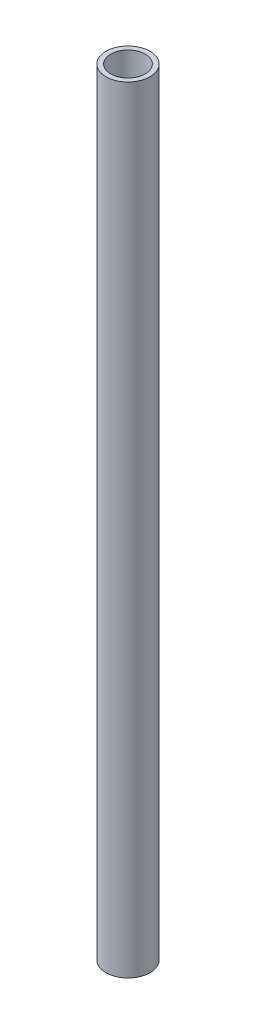
ISO-10303-21;
HEADER;
FILE_DESCRIPTION(('STEP AP214'),'2;1');
FILE_NAME('part.step','',(''),(''),'','','');
FILE_SCHEMA(('AUTOMOTIVE_DESIGN { 1 0 10303 214 1 1 1 1 }'));
ENDSEC;
DATA;
#1=APPLICATION_CONTEXT('core data for automotive mechanical design processes');
#2=APPLICATION_PROTOCOL_DEFINITION('international standard','automotive_design',2000,#1);
#3=PRODUCT_CONTEXT('',#1,'mechanical');
#4=PRODUCT('Part','Part','',(#3));
#5=PRODUCT_RELATED_PRODUCT_CATEGORY('part','',(#4));
#6=PRODUCT_DEFINITION_FORMATION('','',#4);
#7=PRODUCT_DEFINITION_CONTEXT('part definition',#1,'design');
#8=PRODUCT_DEFINITION('design','',#6,#7);
#9=PRODUCT_DEFINITION_SHAPE('','',#8);
#10=(LENGTH_UNIT() NAMED_UNIT(*) SI_UNIT(.MILLI.,.METRE.));
#11=(NAMED_UNIT(*) PLANE_ANGLE_UNIT() SI_UNIT($,.RADIAN.));
#12=(NAMED_UNIT(*) SI_UNIT($,.STERADIAN.) SOLID_ANGLE_UNIT());
#13=UNCERTAINTY_MEASURE_WITH_UNIT(LENGTH_MEASURE(1.E-05),#10,'distance_accuracy_value','');
#14=(GEOMETRIC_REPRESENTATION_CONTEXT(3) GLOBAL_UNCERTAINTY_ASSIGNED_CONTEXT((#13)) GLOBAL_UNIT_ASSIGNED_CONTEXT((#10,
#11,#12)) REPRESENTATION_CONTEXT('',''));
#15=CARTESIAN_POINT('',(0.,0.,0.));
#16=DIRECTION('',(0.,0.,1.));
#17=DIRECTION('',(1.,0.,0.));
#18=AXIS2_PLACEMENT_3D('',#15,#16,#17);
#19=CARTESIAN_POINT('',(0.,279.4,0.));
#20=DIRECTION('',(0.,1.,0.));
#21=DIRECTION('',(0.,0.,1.));
#22=AXIS2_PLACEMENT_3D('',#19,#20,#21);
#23=PLANE('',#22);
#24=CARTESIAN_POINT('',(0.,279.4,0.));
#25=DIRECTION('',(0.,1.,0.));
#26=DIRECTION('',(0.,0.,1.));
#27=AXIS2_PLACEMENT_3D('',#24,#25,#26);
#28=CIRCLE('',#27,7.9375);
#29=CARTESIAN_POINT('',(0.,279.4,7.9375));
#30=VERTEX_POINT('',#29);
#31=EDGE_CURVE('E10',#30,#30,#28,.T.);
#32=ORIENTED_EDGE('',*,*,#31,.T.);
#33=EDGE_LOOP('',(#32));
#34=FACE_BOUND('',#33,.T.);
#35=CARTESIAN_POINT('',(0.,279.4,0.));
#36=DIRECTION('',(0.,1.,0.));
#37=DIRECTION('',(0.,0.,1.));
#38=AXIS2_PLACEMENT_3D('',#35,#36,#37);
#39=CIRCLE('',#38,6.2103);
#40=CARTESIAN_POINT('',(0.,279.4,6.2103));
#41=VERTEX_POINT('',#40);
#42=EDGE_CURVE('E50',#41,#41,#39,.T.);
#43=ORIENTED_EDGE('',*,*,#42,.F.);
#44=EDGE_LOOP('',(#43));
#45=FACE_BOUND('',#44,.T.);
#46=ADVANCED_FACE('F39',(#34,#45),#23,.T.);
#47=CARTESIAN_POINT('',(0.,0.,0.));
#48=DIRECTION('',(0.,1.,0.));
#49=DIRECTION('',(0.,0.,1.));
#50=AXIS2_PLACEMENT_3D('',#47,#48,#49);
#51=PLANE('',#50);
#52=CARTESIAN_POINT('',(0.,0.,0.));
#53=DIRECTION('',(0.,1.,0.));
#54=DIRECTION('',(0.,0.,1.));
#55=AXIS2_PLACEMENT_3D('',#52,#53,#54);
#56=CIRCLE('',#55,7.9375);
#57=CARTESIAN_POINT('',(0.,0.,7.9375));
#58=VERTEX_POINT('',#57);
#59=EDGE_CURVE('E43',#58,#58,#56,.T.);
#60=ORIENTED_EDGE('',*,*,#59,.F.);
#61=EDGE_LOOP('',(#60));
#62=FACE_BOUND('',#61,.T.);
#63=CARTESIAN_POINT('',(0.,0.,0.));
#64=DIRECTION('',(0.,1.,0.));
#65=DIRECTION('',(0.,0.,1.));
#66=AXIS2_PLACEMENT_3D('',#63,#64,#65);
#67=CIRCLE('',#66,6.2103);
#68=CARTESIAN_POINT('',(0.,0.,6.2103));
#69=VERTEX_POINT('',#68);
#70=EDGE_CURVE('E52',#69,#69,#67,.T.);
#71=ORIENTED_EDGE('',*,*,#70,.T.);
#72=EDGE_LOOP('',(#71));
#73=FACE_BOUND('',#72,.T.);
#74=ADVANCED_FACE('F62',(#62,#73),#51,.F.);
#75=CARTESIAN_POINT('',(0.,279.4,0.));
#76=DIRECTION('',(0.,-1.,0.));
#77=DIRECTION('',(0.,0.,-1.));
#78=AXIS2_PLACEMENT_3D('',#75,#76,#77);
#79=CYLINDRICAL_SURFACE('',#78,7.9375);
#80=ORIENTED_EDGE('',*,*,#31,.F.);
#81=EDGE_LOOP('',(#80));
#82=FACE_BOUND('',#81,.T.);
#83=ORIENTED_EDGE('',*,*,#59,.T.);
#84=EDGE_LOOP('',(#83));
#85=FACE_BOUND('',#84,.T.);
#86=ADVANCED_FACE('F41',(#82,#85),#79,.T.);
#87=CARTESIAN_POINT('',(0.,279.4,0.));
#88=DIRECTION('',(0.,-1.,0.));
#89=DIRECTION('',(0.,0.,-1.));
#90=AXIS2_PLACEMENT_3D('',#87,#88,#89);
#91=CYLINDRICAL_SURFACE('',#90,6.2103);
#92=ORIENTED_EDGE('',*,*,#42,.T.);
#93=EDGE_LOOP('',(#92));
#94=FACE_BOUND('',#93,.T.);
#95=ORIENTED_EDGE('',*,*,#70,.F.);
#96=EDGE_LOOP('',(#95));
#97=FACE_BOUND('',#96,.T.);
#98=ADVANCED_FACE('F58',(#94,#97),#91,.F.);
#99=CLOSED_SHELL('',(#46,#74,#86,#98));
#100=MANIFOLD_SOLID_BREP('B2',#99);
#101=ADVANCED_BREP_SHAPE_REPRESENTATION('',(#18,#100),#14);
#102=SHAPE_DEFINITION_REPRESENTATION(#9,#101);
ENDSEC;
END-ISO-10303-21;
